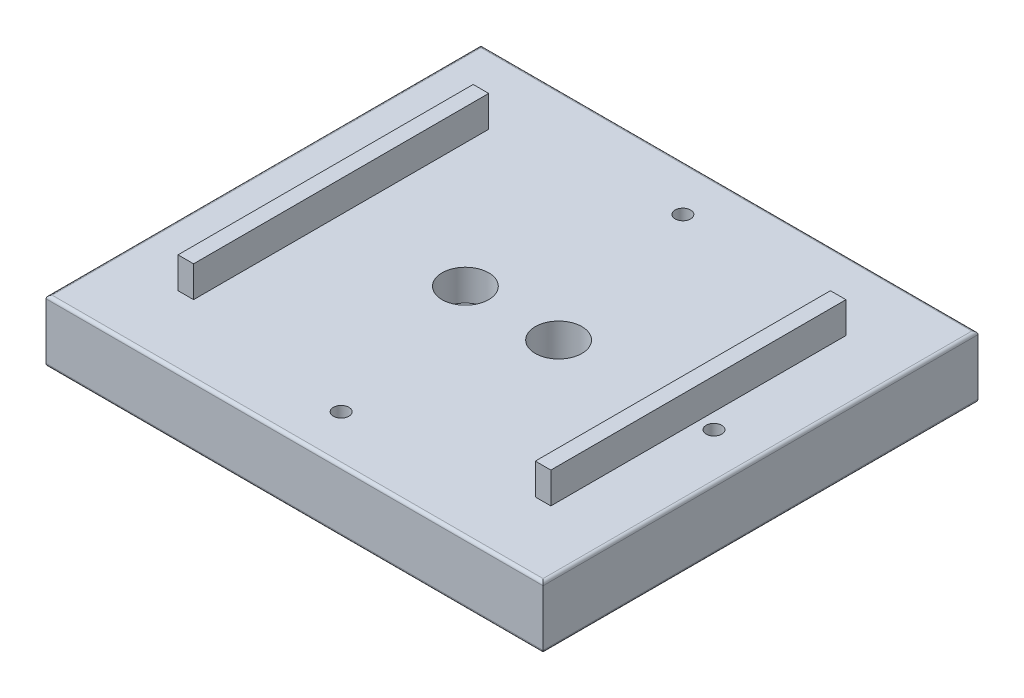
ISO-10303-21;
HEADER;
FILE_DESCRIPTION(('STEP AP214'),'2;1');
FILE_NAME('part.step','',(''),(''),'','','');
FILE_SCHEMA(('AUTOMOTIVE_DESIGN { 1 0 10303 214 1 1 1 1 }'));
ENDSEC;
DATA;
#1=APPLICATION_CONTEXT('core data for automotive mechanical design processes');
#2=APPLICATION_PROTOCOL_DEFINITION('international standard','automotive_design',2000,#1);
#3=PRODUCT_CONTEXT('',#1,'mechanical');
#4=PRODUCT('Part','Part','',(#3));
#5=PRODUCT_RELATED_PRODUCT_CATEGORY('part','',(#4));
#6=PRODUCT_DEFINITION_FORMATION('','',#4);
#7=PRODUCT_DEFINITION_CONTEXT('part definition',#1,'design');
#8=PRODUCT_DEFINITION('design','',#6,#7);
#9=PRODUCT_DEFINITION_SHAPE('','',#8);
#10=(LENGTH_UNIT() NAMED_UNIT(*) SI_UNIT(.MILLI.,.METRE.));
#11=(NAMED_UNIT(*) PLANE_ANGLE_UNIT() SI_UNIT($,.RADIAN.));
#12=(NAMED_UNIT(*) SI_UNIT($,.STERADIAN.) SOLID_ANGLE_UNIT());
#13=UNCERTAINTY_MEASURE_WITH_UNIT(LENGTH_MEASURE(1.E-05),#10,'distance_accuracy_value','');
#14=(GEOMETRIC_REPRESENTATION_CONTEXT(3) GLOBAL_UNCERTAINTY_ASSIGNED_CONTEXT((#13)) GLOBAL_UNIT_ASSIGNED_CONTEXT((#10,
#11,#12)) REPRESENTATION_CONTEXT('',''));
#15=CARTESIAN_POINT('',(0.,0.,0.));
#16=DIRECTION('',(0.,0.,1.));
#17=DIRECTION('',(1.,0.,0.));
#18=AXIS2_PLACEMENT_3D('',#15,#16,#17);
#19=CARTESIAN_POINT('',(0.,20.,0.));
#20=DIRECTION('',(0.,-1.,0.));
#21=DIRECTION('',(0.,0.,-1.));
#22=AXIS2_PLACEMENT_3D('',#19,#20,#21);
#23=PLANE('',#22);
#24=CARTESIAN_POINT('',(-15.,20.,0.));
#25=DIRECTION('',(0.,-1.,0.));
#26=DIRECTION('',(0.,0.,1.));
#27=AXIS2_PLACEMENT_3D('',#24,#25,#26);
#28=CIRCLE('',#27,7.5);
#29=CARTESIAN_POINT('',(-15.,20.,7.5));
#30=VERTEX_POINT('',#29);
#31=EDGE_CURVE('E754',#30,#30,#28,.T.);
#32=ORIENTED_EDGE('',*,*,#31,.T.);
#33=EDGE_LOOP('',(#32));
#34=FACE_BOUND('',#33,.T.);
#35=CARTESIAN_POINT('',(15.,20.,0.));
#36=DIRECTION('',(0.,-1.,0.));
#37=DIRECTION('',(0.,0.,-1.));
#38=AXIS2_PLACEMENT_3D('',#35,#36,#37);
#39=CIRCLE('',#38,7.5);
#40=CARTESIAN_POINT('',(15.,20.,-7.5));
#41=VERTEX_POINT('',#40);
#42=EDGE_CURVE('E277',#41,#41,#39,.T.);
#43=ORIENTED_EDGE('',*,*,#42,.T.);
#44=EDGE_LOOP('',(#43));
#45=FACE_BOUND('',#44,.T.);
#46=DIRECTION('',(-1.,0.,0.));
#47=VECTOR('',#46,1.);
#48=CARTESIAN_POINT('',(0.,20.,-69.));
#49=LINE('',#48,#47);
#50=CARTESIAN_POINT('',(79.,20.,-69.));
#51=VERTEX_POINT('',#50);
#52=CARTESIAN_POINT('',(-79.,20.,-69.));
#53=VERTEX_POINT('',#52);
#54=EDGE_CURVE('E233',#51,#53,#49,.T.);
#55=ORIENTED_EDGE('',*,*,#54,.T.);
#56=DIRECTION('',(0.,0.,1.));
#57=VECTOR('',#56,1.);
#58=CARTESIAN_POINT('',(-79.,20.,0.));
#59=LINE('',#58,#57);
#60=CARTESIAN_POINT('',(-79.,20.,69.));
#61=VERTEX_POINT('',#60);
#62=EDGE_CURVE('E237',#53,#61,#59,.T.);
#63=ORIENTED_EDGE('',*,*,#62,.T.);
#64=DIRECTION('',(1.,0.,0.));
#65=VECTOR('',#64,1.);
#66=CARTESIAN_POINT('',(0.,20.,69.));
#67=LINE('',#66,#65);
#68=CARTESIAN_POINT('',(79.,20.,69.));
#69=VERTEX_POINT('',#68);
#70=EDGE_CURVE('E235',#61,#69,#67,.T.);
#71=ORIENTED_EDGE('',*,*,#70,.T.);
#72=DIRECTION('',(0.,0.,-1.));
#73=VECTOR('',#72,1.);
#74=CARTESIAN_POINT('',(79.,20.,0.));
#75=LINE('',#74,#73);
#76=EDGE_CURVE('E231',#69,#51,#75,.T.);
#77=ORIENTED_EDGE('',*,*,#76,.T.);
#78=EDGE_LOOP('',(#55,#63,#71,#77));
#79=FACE_BOUND('',#78,.T.);
#80=CARTESIAN_POINT('',(65.,20.,0.));
#81=DIRECTION('',(0.,-1.,0.));
#82=DIRECTION('',(0.,0.,-1.));
#83=AXIS2_PLACEMENT_3D('',#80,#81,#82);
#84=CIRCLE('',#83,2.5);
#85=CARTESIAN_POINT('',(65.,20.,-2.5));
#86=VERTEX_POINT('',#85);
#87=EDGE_CURVE('E771',#86,#86,#84,.T.);
#88=ORIENTED_EDGE('',*,*,#87,.T.);
#89=EDGE_LOOP('',(#88));
#90=FACE_BOUND('',#89,.T.);
#91=CARTESIAN_POINT('',(0.,20.,-55.));
#92=DIRECTION('',(0.,-1.,0.));
#93=DIRECTION('',(0.,0.,-1.));
#94=AXIS2_PLACEMENT_3D('',#91,#92,#93);
#95=CIRCLE('',#94,2.5);
#96=CARTESIAN_POINT('',(0.,20.,-57.5));
#97=VERTEX_POINT('',#96);
#98=EDGE_CURVE('E780',#97,#97,#95,.T.);
#99=ORIENTED_EDGE('',*,*,#98,.T.);
#100=EDGE_LOOP('',(#99));
#101=FACE_BOUND('',#100,.T.);
#102=CARTESIAN_POINT('',(0.,20.,55.));
#103=DIRECTION('',(0.,-1.,0.));
#104=DIRECTION('',(0.,0.,-1.));
#105=AXIS2_PLACEMENT_3D('',#102,#103,#104);
#106=CIRCLE('',#105,2.5);
#107=CARTESIAN_POINT('',(0.,20.,52.5));
#108=VERTEX_POINT('',#107);
#109=EDGE_CURVE('E789',#108,#108,#106,.T.);
#110=ORIENTED_EDGE('',*,*,#109,.T.);
#111=EDGE_LOOP('',(#110));
#112=FACE_BOUND('',#111,.T.);
#113=CARTESIAN_POINT('',(-65.,20.,0.));
#114=DIRECTION('',(0.,-1.,0.));
#115=DIRECTION('',(0.,0.,-1.));
#116=AXIS2_PLACEMENT_3D('',#113,#114,#115);
#117=CIRCLE('',#116,2.5);
#118=CARTESIAN_POINT('',(-65.,20.,-2.5));
#119=VERTEX_POINT('',#118);
#120=EDGE_CURVE('E798',#119,#119,#117,.T.);
#121=ORIENTED_EDGE('',*,*,#120,.T.);
#122=EDGE_LOOP('',(#121));
#123=FACE_BOUND('',#122,.T.);
#124=DIRECTION('',(0.,0.,1.));
#125=VECTOR('',#124,1.);
#126=CARTESIAN_POINT('',(-60.,20.,-47.5));
#127=LINE('',#126,#125);
#128=CARTESIAN_POINT('',(-60.,20.,-47.5));
#129=VERTEX_POINT('',#128);
#130=CARTESIAN_POINT('',(-60.,20.,47.5));
#131=VERTEX_POINT('',#130);
#132=EDGE_CURVE('E181',#129,#131,#127,.T.);
#133=ORIENTED_EDGE('',*,*,#132,.F.);
#134=DIRECTION('',(-1.,0.,0.));
#135=VECTOR('',#134,1.);
#136=CARTESIAN_POINT('',(-60.,20.,-47.5));
#137=LINE('',#136,#135);
#138=CARTESIAN_POINT('',(-55.,20.,-47.5));
#139=VERTEX_POINT('',#138);
#140=EDGE_CURVE('E194',#139,#129,#137,.T.);
#141=ORIENTED_EDGE('',*,*,#140,.F.);
#142=DIRECTION('',(0.,0.,-1.));
#143=VECTOR('',#142,1.);
#144=CARTESIAN_POINT('',(-55.,20.,-47.5));
#145=LINE('',#144,#143);
#146=CARTESIAN_POINT('',(-55.,20.,47.5));
#147=VERTEX_POINT('',#146);
#148=EDGE_CURVE('E203',#147,#139,#145,.T.);
#149=ORIENTED_EDGE('',*,*,#148,.F.);
#150=DIRECTION('',(1.,0.,0.));
#151=VECTOR('',#150,1.);
#152=CARTESIAN_POINT('',(-60.,20.,47.5));
#153=LINE('',#152,#151);
#154=EDGE_CURVE('E184',#131,#147,#153,.T.);
#155=ORIENTED_EDGE('',*,*,#154,.F.);
#156=EDGE_LOOP('',(#133,#141,#149,#155));
#157=FACE_BOUND('',#156,.T.);
#158=DIRECTION('',(0.,0.,-1.));
#159=VECTOR('',#158,1.);
#160=CARTESIAN_POINT('',(60.,20.,-47.5));
#161=LINE('',#160,#159);
#162=CARTESIAN_POINT('',(60.,20.,47.4999999999999));
#163=VERTEX_POINT('',#162);
#164=CARTESIAN_POINT('',(60.,20.,-47.5));
#165=VERTEX_POINT('',#164);
#166=EDGE_CURVE('E180',#163,#165,#161,.T.);
#167=ORIENTED_EDGE('',*,*,#166,.F.);
#168=DIRECTION('',(1.,0.,0.));
#169=VECTOR('',#168,1.);
#170=CARTESIAN_POINT('',(60.,20.,47.4999999999999));
#171=LINE('',#170,#169);
#172=CARTESIAN_POINT('',(55.,20.,47.5));
#173=VERTEX_POINT('',#172);
#174=EDGE_CURVE('E177',#173,#163,#171,.T.);
#175=ORIENTED_EDGE('',*,*,#174,.F.);
#176=DIRECTION('',(0.,0.,1.));
#177=VECTOR('',#176,1.);
#178=CARTESIAN_POINT('',(55.,20.,-47.5));
#179=LINE('',#178,#177);
#180=CARTESIAN_POINT('',(55.,20.,-47.5));
#181=VERTEX_POINT('',#180);
#182=EDGE_CURVE('E807',#181,#173,#179,.T.);
#183=ORIENTED_EDGE('',*,*,#182,.F.);
#184=DIRECTION('',(-1.,0.,0.));
#185=VECTOR('',#184,1.);
#186=CARTESIAN_POINT('',(60.,20.,-47.5));
#187=LINE('',#186,#185);
#188=EDGE_CURVE('E805',#165,#181,#187,.T.);
#189=ORIENTED_EDGE('',*,*,#188,.F.);
#190=EDGE_LOOP('',(#167,#175,#183,#189));
#191=FACE_BOUND('',#190,.T.);
#192=ADVANCED_FACE('F41',(#34,#45,#79,#90,#101,#112,#123,#157,#191),#23,.F.);
#193=CARTESIAN_POINT('',(-80.,20.,70.));
#194=DIRECTION('',(1.,0.,0.));
#195=DIRECTION('',(0.,0.,-1.));
#196=AXIS2_PLACEMENT_3D('',#193,#194,#195);
#197=PLANE('',#196);
#198=DIRECTION('',(0.,-1.,0.));
#199=VECTOR('',#198,1.);
#200=CARTESIAN_POINT('',(-80.,20.,70.));
#201=LINE('',#200,#199);
#202=CARTESIAN_POINT('',(-80.,19.,70.));
#203=VERTEX_POINT('',#202);
#204=CARTESIAN_POINT('',(-80.,1.,70.));
#205=VERTEX_POINT('',#204);
#206=EDGE_CURVE('E228',#203,#205,#201,.T.);
#207=ORIENTED_EDGE('',*,*,#206,.F.);
#208=DIRECTION('',(0.,0.,1.));
#209=VECTOR('',#208,1.);
#210=CARTESIAN_POINT('',(-80.,19.,70.));
#211=LINE('',#210,#209);
#212=CARTESIAN_POINT('',(-80.,19.,-70.));
#213=VERTEX_POINT('',#212);
#214=EDGE_CURVE('E242',#203,#213,#211,.F.);
#215=ORIENTED_EDGE('',*,*,#214,.T.);
#216=DIRECTION('',(0.,-1.,0.));
#217=VECTOR('',#216,1.);
#218=CARTESIAN_POINT('',(-80.,20.,-70.));
#219=LINE('',#218,#217);
#220=CARTESIAN_POINT('',(-80.,1.,-70.));
#221=VERTEX_POINT('',#220);
#222=EDGE_CURVE('E219',#213,#221,#219,.T.);
#223=ORIENTED_EDGE('',*,*,#222,.T.);
#224=DIRECTION('',(0.,0.,1.));
#225=VECTOR('',#224,1.);
#226=CARTESIAN_POINT('',(-80.,1.,70.));
#227=LINE('',#226,#225);
#228=EDGE_CURVE('E240',#221,#205,#227,.T.);
#229=ORIENTED_EDGE('',*,*,#228,.T.);
#230=EDGE_LOOP('',(#207,#215,#223,#229));
#231=FACE_BOUND('',#230,.T.);
#232=ADVANCED_FACE('F315',(#231),#197,.F.);
#233=CARTESIAN_POINT('',(-80.,20.,70.));
#234=DIRECTION('',(0.,0.,-1.));
#235=DIRECTION('',(-1.,0.,0.));
#236=AXIS2_PLACEMENT_3D('',#233,#234,#235);
#237=PLANE('',#236);
#238=DIRECTION('',(0.,-1.,0.));
#239=VECTOR('',#238,1.);
#240=CARTESIAN_POINT('',(80.,20.,70.));
#241=LINE('',#240,#239);
#242=CARTESIAN_POINT('',(80.,19.,70.));
#243=VERTEX_POINT('',#242);
#244=CARTESIAN_POINT('',(80.,1.,70.));
#245=VERTEX_POINT('',#244);
#246=EDGE_CURVE('E225',#243,#245,#241,.T.);
#247=ORIENTED_EDGE('',*,*,#246,.F.);
#248=DIRECTION('',(1.,0.,0.));
#249=VECTOR('',#248,1.);
#250=CARTESIAN_POINT('',(-80.,19.,70.));
#251=LINE('',#250,#249);
#252=EDGE_CURVE('E247',#243,#203,#251,.F.);
#253=ORIENTED_EDGE('',*,*,#252,.T.);
#254=ORIENTED_EDGE('',*,*,#206,.T.);
#255=DIRECTION('',(1.,0.,0.));
#256=VECTOR('',#255,1.);
#257=CARTESIAN_POINT('',(80.,1.,70.));
#258=LINE('',#257,#256);
#259=EDGE_CURVE('E245',#205,#245,#258,.T.);
#260=ORIENTED_EDGE('',*,*,#259,.T.);
#261=EDGE_LOOP('',(#247,#253,#254,#260));
#262=FACE_BOUND('',#261,.T.);
#263=ADVANCED_FACE('F330',(#262),#237,.F.);
#264=CARTESIAN_POINT('',(80.,20.,70.));
#265=DIRECTION('',(-1.,0.,0.));
#266=DIRECTION('',(0.,0.,1.));
#267=AXIS2_PLACEMENT_3D('',#264,#265,#266);
#268=PLANE('',#267);
#269=DIRECTION('',(0.,-1.,0.));
#270=VECTOR('',#269,1.);
#271=CARTESIAN_POINT('',(80.,20.,-70.));
#272=LINE('',#271,#270);
#273=CARTESIAN_POINT('',(80.,19.,-70.));
#274=VERTEX_POINT('',#273);
#275=CARTESIAN_POINT('',(80.,1.,-70.));
#276=VERTEX_POINT('',#275);
#277=EDGE_CURVE('E222',#274,#276,#272,.T.);
#278=ORIENTED_EDGE('',*,*,#277,.F.);
#279=DIRECTION('',(0.,0.,-1.));
#280=VECTOR('',#279,1.);
#281=CARTESIAN_POINT('',(80.,19.,70.));
#282=LINE('',#281,#280);
#283=EDGE_CURVE('E256',#274,#243,#282,.F.);
#284=ORIENTED_EDGE('',*,*,#283,.T.);
#285=ORIENTED_EDGE('',*,*,#246,.T.);
#286=DIRECTION('',(0.,0.,-1.));
#287=VECTOR('',#286,1.);
#288=CARTESIAN_POINT('',(80.,1.,-70.));
#289=LINE('',#288,#287);
#290=EDGE_CURVE('E253',#245,#276,#289,.T.);
#291=ORIENTED_EDGE('',*,*,#290,.T.);
#292=EDGE_LOOP('',(#278,#284,#285,#291));
#293=FACE_BOUND('',#292,.T.);
#294=ADVANCED_FACE('F301',(#293),#268,.F.);
#295=CARTESIAN_POINT('',(-80.,20.,-70.));
#296=DIRECTION('',(0.,0.,1.));
#297=DIRECTION('',(1.,0.,0.));
#298=AXIS2_PLACEMENT_3D('',#295,#296,#297);
#299=PLANE('',#298);
#300=ORIENTED_EDGE('',*,*,#222,.F.);
#301=DIRECTION('',(-1.,0.,0.));
#302=VECTOR('',#301,1.);
#303=CARTESIAN_POINT('',(-80.,19.,-70.));
#304=LINE('',#303,#302);
#305=EDGE_CURVE('E251',#213,#274,#304,.F.);
#306=ORIENTED_EDGE('',*,*,#305,.T.);
#307=ORIENTED_EDGE('',*,*,#277,.T.);
#308=DIRECTION('',(-1.,0.,0.));
#309=VECTOR('',#308,1.);
#310=CARTESIAN_POINT('',(-80.,1.,-70.));
#311=LINE('',#310,#309);
#312=EDGE_CURVE('E249',#276,#221,#311,.T.);
#313=ORIENTED_EDGE('',*,*,#312,.T.);
#314=EDGE_LOOP('',(#300,#306,#307,#313));
#315=FACE_BOUND('',#314,.T.);
#316=ADVANCED_FACE('F304',(#315),#299,.F.);
#317=CARTESIAN_POINT('',(0.,0.,0.));
#318=DIRECTION('',(0.,-1.,0.));
#319=DIRECTION('',(0.,0.,-1.));
#320=AXIS2_PLACEMENT_3D('',#317,#318,#319);
#321=PLANE('',#320);
#322=DIRECTION('',(-1.,0.,0.));
#323=VECTOR('',#322,1.);
#324=CARTESIAN_POINT('',(80.,0.,-69.));
#325=LINE('',#324,#323);
#326=CARTESIAN_POINT('',(-79.,0.,-69.));
#327=VERTEX_POINT('',#326);
#328=CARTESIAN_POINT('',(79.,0.,-69.));
#329=VERTEX_POINT('',#328);
#330=EDGE_CURVE('E258',#327,#329,#325,.F.);
#331=ORIENTED_EDGE('',*,*,#330,.T.);
#332=DIRECTION('',(0.,0.,-1.));
#333=VECTOR('',#332,1.);
#334=CARTESIAN_POINT('',(79.,0.,70.));
#335=LINE('',#334,#333);
#336=CARTESIAN_POINT('',(79.,0.,69.));
#337=VERTEX_POINT('',#336);
#338=EDGE_CURVE('E11',#329,#337,#335,.F.);
#339=ORIENTED_EDGE('',*,*,#338,.T.);
#340=DIRECTION('',(1.,0.,0.));
#341=VECTOR('',#340,1.);
#342=CARTESIAN_POINT('',(-80.,0.,69.));
#343=LINE('',#342,#341);
#344=CARTESIAN_POINT('',(-79.,0.,69.));
#345=VERTEX_POINT('',#344);
#346=EDGE_CURVE('E50',#337,#345,#343,.F.);
#347=ORIENTED_EDGE('',*,*,#346,.T.);
#348=DIRECTION('',(0.,0.,1.));
#349=VECTOR('',#348,1.);
#350=CARTESIAN_POINT('',(-79.,0.,-70.));
#351=LINE('',#350,#349);
#352=EDGE_CURVE('E260',#345,#327,#351,.F.);
#353=ORIENTED_EDGE('',*,*,#352,.T.);
#354=EDGE_LOOP('',(#331,#339,#347,#353));
#355=FACE_BOUND('',#354,.T.);
#356=CARTESIAN_POINT('',(15.,0.,0.));
#357=DIRECTION('',(0.,-1.,0.));
#358=DIRECTION('',(0.,0.,-1.));
#359=AXIS2_PLACEMENT_3D('',#356,#357,#358);
#360=CIRCLE('',#359,16.);
#361=CARTESIAN_POINT('',(15.,0.,-16.));
#362=VERTEX_POINT('',#361);
#363=EDGE_CURVE('E274',#362,#362,#360,.T.);
#364=ORIENTED_EDGE('',*,*,#363,.F.);
#365=EDGE_LOOP('',(#364));
#366=FACE_BOUND('',#365,.T.);
#367=CARTESIAN_POINT('',(65.,0.,0.));
#368=DIRECTION('',(0.,-1.,0.));
#369=DIRECTION('',(0.,0.,-1.));
#370=AXIS2_PLACEMENT_3D('',#367,#368,#369);
#371=CIRCLE('',#370,3.025);
#372=CARTESIAN_POINT('',(65.,0.,-3.025));
#373=VERTEX_POINT('',#372);
#374=EDGE_CURVE('E763',#373,#373,#371,.T.);
#375=ORIENTED_EDGE('',*,*,#374,.F.);
#376=EDGE_LOOP('',(#375));
#377=FACE_BOUND('',#376,.T.);
#378=CARTESIAN_POINT('',(0.,0.,-55.));
#379=DIRECTION('',(0.,-1.,0.));
#380=DIRECTION('',(0.,0.,-1.));
#381=AXIS2_PLACEMENT_3D('',#378,#379,#380);
#382=CIRCLE('',#381,3.025);
#383=CARTESIAN_POINT('',(0.,0.,-58.025));
#384=VERTEX_POINT('',#383);
#385=EDGE_CURVE('E774',#384,#384,#382,.T.);
#386=ORIENTED_EDGE('',*,*,#385,.F.);
#387=EDGE_LOOP('',(#386));
#388=FACE_BOUND('',#387,.T.);
#389=CARTESIAN_POINT('',(0.,0.,55.));
#390=DIRECTION('',(0.,-1.,0.));
#391=DIRECTION('',(0.,0.,-1.));
#392=AXIS2_PLACEMENT_3D('',#389,#390,#391);
#393=CIRCLE('',#392,3.025);
#394=CARTESIAN_POINT('',(0.,0.,51.975));
#395=VERTEX_POINT('',#394);
#396=EDGE_CURVE('E783',#395,#395,#393,.T.);
#397=ORIENTED_EDGE('',*,*,#396,.F.);
#398=EDGE_LOOP('',(#397));
#399=FACE_BOUND('',#398,.T.);
#400=CARTESIAN_POINT('',(-65.,0.,0.));
#401=DIRECTION('',(0.,-1.,0.));
#402=DIRECTION('',(0.,0.,-1.));
#403=AXIS2_PLACEMENT_3D('',#400,#401,#402);
#404=CIRCLE('',#403,3.025);
#405=CARTESIAN_POINT('',(-65.,0.,-3.025));
#406=VERTEX_POINT('',#405);
#407=EDGE_CURVE('E792',#406,#406,#404,.T.);
#408=ORIENTED_EDGE('',*,*,#407,.F.);
#409=EDGE_LOOP('',(#408));
#410=FACE_BOUND('',#409,.T.);
#411=ADVANCED_FACE('F290',(#355,#366,#377,#388,#399,#410),#321,.T.);
#412=CARTESIAN_POINT('',(-60.,30.,-47.5));
#413=DIRECTION('',(1.,0.,0.));
#414=DIRECTION('',(0.,0.,-1.));
#415=AXIS2_PLACEMENT_3D('',#412,#413,#414);
#416=PLANE('',#415);
#417=ORIENTED_EDGE('',*,*,#132,.T.);
#418=DIRECTION('',(0.,-1.,0.));
#419=VECTOR('',#418,1.);
#420=CARTESIAN_POINT('',(-60.,30.,47.5));
#421=LINE('',#420,#419);
#422=CARTESIAN_POINT('',(-60.,30.,47.5));
#423=VERTEX_POINT('',#422);
#424=EDGE_CURVE('E216',#423,#131,#421,.T.);
#425=ORIENTED_EDGE('',*,*,#424,.F.);
#426=DIRECTION('',(0.,0.,1.));
#427=VECTOR('',#426,1.);
#428=CARTESIAN_POINT('',(-60.,30.,-47.5));
#429=LINE('',#428,#427);
#430=CARTESIAN_POINT('',(-60.,30.,-47.5));
#431=VERTEX_POINT('',#430);
#432=EDGE_CURVE('E190',#431,#423,#429,.T.);
#433=ORIENTED_EDGE('',*,*,#432,.F.);
#434=DIRECTION('',(0.,-1.,0.));
#435=VECTOR('',#434,1.);
#436=CARTESIAN_POINT('',(-60.,30.,-47.5));
#437=LINE('',#436,#435);
#438=EDGE_CURVE('E199',#431,#129,#437,.T.);
#439=ORIENTED_EDGE('',*,*,#438,.T.);
#440=EDGE_LOOP('',(#417,#425,#433,#439));
#441=FACE_BOUND('',#440,.T.);
#442=ADVANCED_FACE('F348',(#441),#416,.F.);
#443=CARTESIAN_POINT('',(-60.,30.,47.5));
#444=DIRECTION('',(0.,0.,-1.));
#445=DIRECTION('',(-1.,0.,0.));
#446=AXIS2_PLACEMENT_3D('',#443,#444,#445);
#447=PLANE('',#446);
#448=ORIENTED_EDGE('',*,*,#154,.T.);
#449=DIRECTION('',(0.,-1.,0.));
#450=VECTOR('',#449,1.);
#451=CARTESIAN_POINT('',(-55.,30.,47.5));
#452=LINE('',#451,#450);
#453=CARTESIAN_POINT('',(-55.,30.,47.5));
#454=VERTEX_POINT('',#453);
#455=EDGE_CURVE('E213',#454,#147,#452,.T.);
#456=ORIENTED_EDGE('',*,*,#455,.F.);
#457=DIRECTION('',(1.,0.,0.));
#458=VECTOR('',#457,1.);
#459=CARTESIAN_POINT('',(-60.,30.,47.5));
#460=LINE('',#459,#458);
#461=EDGE_CURVE('E193',#423,#454,#460,.T.);
#462=ORIENTED_EDGE('',*,*,#461,.F.);
#463=ORIENTED_EDGE('',*,*,#424,.T.);
#464=EDGE_LOOP('',(#448,#456,#462,#463));
#465=FACE_BOUND('',#464,.T.);
#466=ADVANCED_FACE('F368',(#465),#447,.F.);
#467=CARTESIAN_POINT('',(-55.,30.,-47.5));
#468=DIRECTION('',(-1.,0.,0.));
#469=DIRECTION('',(0.,0.,1.));
#470=AXIS2_PLACEMENT_3D('',#467,#468,#469);
#471=PLANE('',#470);
#472=ORIENTED_EDGE('',*,*,#148,.T.);
#473=DIRECTION('',(0.,-1.,0.));
#474=VECTOR('',#473,1.);
#475=CARTESIAN_POINT('',(-55.,30.,-47.5));
#476=LINE('',#475,#474);
#477=CARTESIAN_POINT('',(-55.,30.,-47.5));
#478=VERTEX_POINT('',#477);
#479=EDGE_CURVE('E210',#478,#139,#476,.T.);
#480=ORIENTED_EDGE('',*,*,#479,.F.);
#481=DIRECTION('',(0.,0.,-1.));
#482=VECTOR('',#481,1.);
#483=CARTESIAN_POINT('',(-55.,30.,-47.5));
#484=LINE('',#483,#482);
#485=EDGE_CURVE('E196',#454,#478,#484,.T.);
#486=ORIENTED_EDGE('',*,*,#485,.F.);
#487=ORIENTED_EDGE('',*,*,#455,.T.);
#488=EDGE_LOOP('',(#472,#480,#486,#487));
#489=FACE_BOUND('',#488,.T.);
#490=ADVANCED_FACE('F375',(#489),#471,.F.);
#491=CARTESIAN_POINT('',(-60.,30.,-47.5));
#492=DIRECTION('',(0.,0.,1.));
#493=DIRECTION('',(1.,0.,0.));
#494=AXIS2_PLACEMENT_3D('',#491,#492,#493);
#495=PLANE('',#494);
#496=ORIENTED_EDGE('',*,*,#140,.T.);
#497=ORIENTED_EDGE('',*,*,#438,.F.);
#498=DIRECTION('',(-1.,0.,0.));
#499=VECTOR('',#498,1.);
#500=CARTESIAN_POINT('',(-60.,30.,-47.5));
#501=LINE('',#500,#499);
#502=EDGE_CURVE('E198',#478,#431,#501,.T.);
#503=ORIENTED_EDGE('',*,*,#502,.F.);
#504=ORIENTED_EDGE('',*,*,#479,.T.);
#505=EDGE_LOOP('',(#496,#497,#503,#504));
#506=FACE_BOUND('',#505,.T.);
#507=ADVANCED_FACE('F382',(#506),#495,.F.);
#508=CARTESIAN_POINT('',(0.,30.,0.));
#509=DIRECTION('',(0.,1.,0.));
#510=DIRECTION('',(0.,0.,1.));
#511=AXIS2_PLACEMENT_3D('',#508,#509,#510);
#512=PLANE('',#511);
#513=ORIENTED_EDGE('',*,*,#432,.T.);
#514=ORIENTED_EDGE('',*,*,#461,.T.);
#515=ORIENTED_EDGE('',*,*,#485,.T.);
#516=ORIENTED_EDGE('',*,*,#502,.T.);
#517=EDGE_LOOP('',(#513,#514,#515,#516));
#518=FACE_BOUND('',#517,.T.);
#519=ADVANCED_FACE('F390',(#518),#512,.T.);
#520=CARTESIAN_POINT('',(60.,30.,-47.5));
#521=DIRECTION('',(-1.,0.,0.));
#522=DIRECTION('',(0.,0.,1.));
#523=AXIS2_PLACEMENT_3D('',#520,#521,#522);
#524=PLANE('',#523);
#525=ORIENTED_EDGE('',*,*,#166,.T.);
#526=DIRECTION('',(0.,-1.,0.));
#527=VECTOR('',#526,1.);
#528=CARTESIAN_POINT('',(60.,30.,-47.5));
#529=LINE('',#528,#527);
#530=CARTESIAN_POINT('',(60.,30.,-47.5));
#531=VERTEX_POINT('',#530);
#532=EDGE_CURVE('E161',#531,#165,#529,.T.);
#533=ORIENTED_EDGE('',*,*,#532,.F.);
#534=DIRECTION('',(0.,0.,-1.));
#535=VECTOR('',#534,1.);
#536=CARTESIAN_POINT('',(60.,30.,-47.5));
#537=LINE('',#536,#535);
#538=CARTESIAN_POINT('',(60.,30.,47.4999999999999));
#539=VERTEX_POINT('',#538);
#540=EDGE_CURVE('E168',#539,#531,#537,.T.);
#541=ORIENTED_EDGE('',*,*,#540,.F.);
#542=DIRECTION('',(0.,-1.,0.));
#543=VECTOR('',#542,1.);
#544=CARTESIAN_POINT('',(60.,30.,47.4999999999999));
#545=LINE('',#544,#543);
#546=EDGE_CURVE('E803',#539,#163,#545,.T.);
#547=ORIENTED_EDGE('',*,*,#546,.T.);
#548=EDGE_LOOP('',(#525,#533,#541,#547));
#549=FACE_BOUND('',#548,.T.);
#550=ADVANCED_FACE('F179',(#549),#524,.F.);
#551=CARTESIAN_POINT('',(60.,30.,-47.5));
#552=DIRECTION('',(0.,0.,1.));
#553=DIRECTION('',(1.,0.,0.));
#554=AXIS2_PLACEMENT_3D('',#551,#552,#553);
#555=PLANE('',#554);
#556=ORIENTED_EDGE('',*,*,#188,.T.);
#557=DIRECTION('',(0.,-1.,0.));
#558=VECTOR('',#557,1.);
#559=CARTESIAN_POINT('',(55.,30.,-47.5));
#560=LINE('',#559,#558);
#561=CARTESIAN_POINT('',(55.,30.,-47.5));
#562=VERTEX_POINT('',#561);
#563=EDGE_CURVE('E164',#562,#181,#560,.T.);
#564=ORIENTED_EDGE('',*,*,#563,.F.);
#565=DIRECTION('',(-1.,0.,0.));
#566=VECTOR('',#565,1.);
#567=CARTESIAN_POINT('',(60.,30.,-47.5));
#568=LINE('',#567,#566);
#569=EDGE_CURVE('E156',#531,#562,#568,.T.);
#570=ORIENTED_EDGE('',*,*,#569,.F.);
#571=ORIENTED_EDGE('',*,*,#532,.T.);
#572=EDGE_LOOP('',(#556,#564,#570,#571));
#573=FACE_BOUND('',#572,.T.);
#574=ADVANCED_FACE('F159',(#573),#555,.F.);
#575=CARTESIAN_POINT('',(55.,30.,-47.5));
#576=DIRECTION('',(1.,0.,0.));
#577=DIRECTION('',(0.,0.,-1.));
#578=AXIS2_PLACEMENT_3D('',#575,#576,#577);
#579=PLANE('',#578);
#580=ORIENTED_EDGE('',*,*,#182,.T.);
#581=DIRECTION('',(0.,-1.,0.));
#582=VECTOR('',#581,1.);
#583=CARTESIAN_POINT('',(55.,30.,47.5));
#584=LINE('',#583,#582);
#585=CARTESIAN_POINT('',(55.,30.,47.5));
#586=VERTEX_POINT('',#585);
#587=EDGE_CURVE('E186',#586,#173,#584,.T.);
#588=ORIENTED_EDGE('',*,*,#587,.F.);
#589=DIRECTION('',(0.,0.,1.));
#590=VECTOR('',#589,1.);
#591=CARTESIAN_POINT('',(55.,30.,-47.5));
#592=LINE('',#591,#590);
#593=EDGE_CURVE('E167',#562,#586,#592,.T.);
#594=ORIENTED_EDGE('',*,*,#593,.F.);
#595=ORIENTED_EDGE('',*,*,#563,.T.);
#596=EDGE_LOOP('',(#580,#588,#594,#595));
#597=FACE_BOUND('',#596,.T.);
#598=ADVANCED_FACE('F411',(#597),#579,.F.);
#599=CARTESIAN_POINT('',(60.,30.,47.4999999999999));
#600=DIRECTION('',(0.,0.,-1.));
#601=DIRECTION('',(-1.,0.,0.));
#602=AXIS2_PLACEMENT_3D('',#599,#600,#601);
#603=PLANE('',#602);
#604=ORIENTED_EDGE('',*,*,#174,.T.);
#605=ORIENTED_EDGE('',*,*,#546,.F.);
#606=DIRECTION('',(1.,0.,0.));
#607=VECTOR('',#606,1.);
#608=CARTESIAN_POINT('',(60.,30.,47.4999999999999));
#609=LINE('',#608,#607);
#610=EDGE_CURVE('E173',#586,#539,#609,.T.);
#611=ORIENTED_EDGE('',*,*,#610,.F.);
#612=ORIENTED_EDGE('',*,*,#587,.T.);
#613=EDGE_LOOP('',(#604,#605,#611,#612));
#614=FACE_BOUND('',#613,.T.);
#615=ADVANCED_FACE('F418',(#614),#603,.F.);
#616=CARTESIAN_POINT('',(0.,30.,0.));
#617=DIRECTION('',(0.,-1.,0.));
#618=DIRECTION('',(0.,0.,-1.));
#619=AXIS2_PLACEMENT_3D('',#616,#617,#618);
#620=PLANE('',#619);
#621=ORIENTED_EDGE('',*,*,#540,.T.);
#622=ORIENTED_EDGE('',*,*,#569,.T.);
#623=ORIENTED_EDGE('',*,*,#593,.T.);
#624=ORIENTED_EDGE('',*,*,#610,.T.);
#625=EDGE_LOOP('',(#621,#622,#623,#624));
#626=FACE_BOUND('',#625,.T.);
#627=ADVANCED_FACE('F171',(#626),#620,.F.);
#628=CARTESIAN_POINT('',(-65.,0.,0.));
#629=DIRECTION('',(0.,-1.,0.));
#630=DIRECTION('',(0.,0.,-1.));
#631=AXIS2_PLACEMENT_3D('',#628,#629,#630);
#632=CYLINDRICAL_SURFACE('',#631,2.5);
#633=ORIENTED_EDGE('',*,*,#120,.F.);
#634=EDGE_LOOP('',(#633));
#635=FACE_BOUND('',#634,.T.);
#636=CARTESIAN_POINT('',(-65.,0.525000000000001,0.));
#637=DIRECTION('',(0.,-1.,0.));
#638=DIRECTION('',(0.,0.,-1.));
#639=AXIS2_PLACEMENT_3D('',#636,#637,#638);
#640=CIRCLE('',#639,2.5);
#641=CARTESIAN_POINT('',(-65.,0.525000000000001,-2.5));
#642=VERTEX_POINT('',#641);
#643=EDGE_CURVE('E795',#642,#642,#640,.T.);
#644=ORIENTED_EDGE('',*,*,#643,.T.);
#645=EDGE_LOOP('',(#644));
#646=FACE_BOUND('',#645,.T.);
#647=ADVANCED_FACE('F433',(#635,#646),#632,.F.);
#648=CARTESIAN_POINT('',(-65.,0.,0.));
#649=DIRECTION('',(0.,-1.,0.));
#650=DIRECTION('',(0.,0.,-1.));
#651=AXIS2_PLACEMENT_3D('',#648,#649,#650);
#652=CONICAL_SURFACE('',#651,3.025,0.785398163397444);
#653=ORIENTED_EDGE('',*,*,#643,.F.);
#654=EDGE_LOOP('',(#653));
#655=FACE_BOUND('',#654,.T.);
#656=ORIENTED_EDGE('',*,*,#407,.T.);
#657=EDGE_LOOP('',(#656));
#658=FACE_BOUND('',#657,.T.);
#659=ADVANCED_FACE('F441',(#655,#658),#652,.F.);
#660=CARTESIAN_POINT('',(0.,0.,55.));
#661=DIRECTION('',(0.,-1.,0.));
#662=DIRECTION('',(0.,0.,-1.));
#663=AXIS2_PLACEMENT_3D('',#660,#661,#662);
#664=CYLINDRICAL_SURFACE('',#663,2.5);
#665=ORIENTED_EDGE('',*,*,#109,.F.);
#666=EDGE_LOOP('',(#665));
#667=FACE_BOUND('',#666,.T.);
#668=CARTESIAN_POINT('',(0.,0.525000000000001,55.));
#669=DIRECTION('',(0.,-1.,0.));
#670=DIRECTION('',(0.,0.,-1.));
#671=AXIS2_PLACEMENT_3D('',#668,#669,#670);
#672=CIRCLE('',#671,2.5);
#673=CARTESIAN_POINT('',(0.,0.525000000000001,52.5));
#674=VERTEX_POINT('',#673);
#675=EDGE_CURVE('E786',#674,#674,#672,.T.);
#676=ORIENTED_EDGE('',*,*,#675,.T.);
#677=EDGE_LOOP('',(#676));
#678=FACE_BOUND('',#677,.T.);
#679=ADVANCED_FACE('F450',(#667,#678),#664,.F.);
#680=CARTESIAN_POINT('',(0.,0.,55.));
#681=DIRECTION('',(0.,-1.,0.));
#682=DIRECTION('',(0.,0.,-1.));
#683=AXIS2_PLACEMENT_3D('',#680,#681,#682);
#684=CONICAL_SURFACE('',#683,3.025,0.785398163397447);
#685=ORIENTED_EDGE('',*,*,#675,.F.);
#686=EDGE_LOOP('',(#685));
#687=FACE_BOUND('',#686,.T.);
#688=ORIENTED_EDGE('',*,*,#396,.T.);
#689=EDGE_LOOP('',(#688));
#690=FACE_BOUND('',#689,.T.);
#691=ADVANCED_FACE('F458',(#687,#690),#684,.F.);
#692=CARTESIAN_POINT('',(0.,0.,-55.));
#693=DIRECTION('',(0.,-1.,0.));
#694=DIRECTION('',(0.,0.,-1.));
#695=AXIS2_PLACEMENT_3D('',#692,#693,#694);
#696=CYLINDRICAL_SURFACE('',#695,2.5);
#697=ORIENTED_EDGE('',*,*,#98,.F.);
#698=EDGE_LOOP('',(#697));
#699=FACE_BOUND('',#698,.T.);
#700=CARTESIAN_POINT('',(0.,0.525000000000001,-55.));
#701=DIRECTION('',(0.,-1.,0.));
#702=DIRECTION('',(0.,0.,-1.));
#703=AXIS2_PLACEMENT_3D('',#700,#701,#702);
#704=CIRCLE('',#703,2.5);
#705=CARTESIAN_POINT('',(0.,0.525000000000001,-57.5));
#706=VERTEX_POINT('',#705);
#707=EDGE_CURVE('E777',#706,#706,#704,.T.);
#708=ORIENTED_EDGE('',*,*,#707,.T.);
#709=EDGE_LOOP('',(#708));
#710=FACE_BOUND('',#709,.T.);
#711=ADVANCED_FACE('F465',(#699,#710),#696,.F.);
#712=CARTESIAN_POINT('',(0.,0.,-55.));
#713=DIRECTION('',(0.,-1.,0.));
#714=DIRECTION('',(0.,0.,-1.));
#715=AXIS2_PLACEMENT_3D('',#712,#713,#714);
#716=CONICAL_SURFACE('',#715,3.025,0.785398163397447);
#717=ORIENTED_EDGE('',*,*,#707,.F.);
#718=EDGE_LOOP('',(#717));
#719=FACE_BOUND('',#718,.T.);
#720=ORIENTED_EDGE('',*,*,#385,.T.);
#721=EDGE_LOOP('',(#720));
#722=FACE_BOUND('',#721,.T.);
#723=ADVANCED_FACE('F473',(#719,#722),#716,.F.);
#724=CARTESIAN_POINT('',(65.,0.,0.));
#725=DIRECTION('',(0.,-1.,0.));
#726=DIRECTION('',(0.,0.,-1.));
#727=AXIS2_PLACEMENT_3D('',#724,#725,#726);
#728=CYLINDRICAL_SURFACE('',#727,2.5);
#729=ORIENTED_EDGE('',*,*,#87,.F.);
#730=EDGE_LOOP('',(#729));
#731=FACE_BOUND('',#730,.T.);
#732=CARTESIAN_POINT('',(65.,0.525000000000001,0.));
#733=DIRECTION('',(0.,-1.,0.));
#734=DIRECTION('',(0.,0.,-1.));
#735=AXIS2_PLACEMENT_3D('',#732,#733,#734);
#736=CIRCLE('',#735,2.5);
#737=CARTESIAN_POINT('',(65.,0.525000000000001,-2.5));
#738=VERTEX_POINT('',#737);
#739=EDGE_CURVE('E768',#738,#738,#736,.T.);
#740=ORIENTED_EDGE('',*,*,#739,.T.);
#741=EDGE_LOOP('',(#740));
#742=FACE_BOUND('',#741,.T.);
#743=ADVANCED_FACE('F481',(#731,#742),#728,.F.);
#744=CARTESIAN_POINT('',(65.,0.,0.));
#745=DIRECTION('',(0.,-1.,0.));
#746=DIRECTION('',(0.,0.,-1.));
#747=AXIS2_PLACEMENT_3D('',#744,#745,#746);
#748=CONICAL_SURFACE('',#747,3.025,0.785398163397444);
#749=ORIENTED_EDGE('',*,*,#739,.F.);
#750=EDGE_LOOP('',(#749));
#751=FACE_BOUND('',#750,.T.);
#752=ORIENTED_EDGE('',*,*,#374,.T.);
#753=EDGE_LOOP('',(#752));
#754=FACE_BOUND('',#753,.T.);
#755=ADVANCED_FACE('F489',(#751,#754),#748,.F.);
#756=CARTESIAN_POINT('',(15.,3.15,0.));
#757=DIRECTION('',(0.,-1.,0.));
#758=DIRECTION('',(0.,0.,-1.));
#759=AXIS2_PLACEMENT_3D('',#756,#757,#758);
#760=CYLINDRICAL_SURFACE('',#759,16.);
#761=CARTESIAN_POINT('',(15.,3.15,0.));
#762=DIRECTION('',(0.,-1.,0.));
#763=DIRECTION('',(0.,0.,-1.));
#764=AXIS2_PLACEMENT_3D('',#761,#762,#763);
#765=CIRCLE('',#764,16.);
#766=CARTESIAN_POINT('',(15.,3.15,-16.));
#767=VERTEX_POINT('',#766);
#768=EDGE_CURVE('E760',#767,#767,#765,.T.);
#769=ORIENTED_EDGE('',*,*,#768,.F.);
#770=EDGE_LOOP('',(#769));
#771=FACE_BOUND('',#770,.T.);
#772=ORIENTED_EDGE('',*,*,#363,.T.);
#773=EDGE_LOOP('',(#772));
#774=FACE_BOUND('',#773,.T.);
#775=ADVANCED_FACE('F496',(#771,#774),#760,.F.);
#776=CARTESIAN_POINT('',(15.,3.15,0.));
#777=DIRECTION('',(0.,-1.,0.));
#778=DIRECTION('',(0.,0.,-1.));
#779=AXIS2_PLACEMENT_3D('',#776,#777,#778);
#780=PLANE('',#779);
#781=CARTESIAN_POINT('',(15.,3.15,0.));
#782=DIRECTION('',(0.,-1.,0.));
#783=DIRECTION('',(0.,0.,-1.));
#784=AXIS2_PLACEMENT_3D('',#781,#782,#783);
#785=CIRCLE('',#784,7.5);
#786=CARTESIAN_POINT('',(15.,3.15,-7.5));
#787=VERTEX_POINT('',#786);
#788=EDGE_CURVE('E45',#787,#787,#785,.T.);
#789=ORIENTED_EDGE('',*,*,#788,.F.);
#790=EDGE_LOOP('',(#789));
#791=FACE_BOUND('',#790,.T.);
#792=ORIENTED_EDGE('',*,*,#768,.T.);
#793=EDGE_LOOP('',(#792));
#794=FACE_BOUND('',#793,.T.);
#795=ADVANCED_FACE('F504',(#791,#794),#780,.T.);
#796=CARTESIAN_POINT('',(79.,19.,0.));
#797=DIRECTION('',(0.,0.,-1.));
#798=DIRECTION('',(-1.,0.,0.));
#799=AXIS2_PLACEMENT_3D('',#796,#797,#798);
#800=CYLINDRICAL_SURFACE('',#799,1.);
#801=CARTESIAN_POINT('',(79.,19.,69.));
#802=DIRECTION('',(0.707106781186547,0.,-0.707106781186547));
#803=DIRECTION('',(-0.707106781186547,0.,-0.707106781186548));
#804=AXIS2_PLACEMENT_3D('',#801,#802,#803);
#805=ELLIPSE('',#804,1.41421356237309,1.);
#806=EDGE_CURVE('E268',#243,#69,#805,.F.);
#807=ORIENTED_EDGE('',*,*,#806,.F.);
#808=ORIENTED_EDGE('',*,*,#283,.F.);
#809=CARTESIAN_POINT('',(79.,19.,-69.));
#810=DIRECTION('',(-0.707106781186547,0.,-0.707106781186548));
#811=DIRECTION('',(0.707106781186547,0.,-0.707106781186547));
#812=AXIS2_PLACEMENT_3D('',#809,#810,#811);
#813=ELLIPSE('',#812,1.4142135623731,1.);
#814=EDGE_CURVE('E271',#51,#274,#813,.T.);
#815=ORIENTED_EDGE('',*,*,#814,.F.);
#816=ORIENTED_EDGE('',*,*,#76,.F.);
#817=EDGE_LOOP('',(#807,#808,#815,#816));
#818=FACE_BOUND('',#817,.T.);
#819=ADVANCED_FACE('F328',(#818),#800,.T.);
#820=CARTESIAN_POINT('',(0.,19.,-69.));
#821=DIRECTION('',(-1.,0.,0.));
#822=DIRECTION('',(0.,0.,1.));
#823=AXIS2_PLACEMENT_3D('',#820,#821,#822);
#824=CYLINDRICAL_SURFACE('',#823,1.);
#825=ORIENTED_EDGE('',*,*,#814,.T.);
#826=ORIENTED_EDGE('',*,*,#305,.F.);
#827=CARTESIAN_POINT('',(-79.,19.,-69.));
#828=DIRECTION('',(-0.707106781186547,0.,0.707106781186548));
#829=DIRECTION('',(-0.707106781186547,0.,-0.707106781186547));
#830=AXIS2_PLACEMENT_3D('',#827,#828,#829);
#831=ELLIPSE('',#830,1.4142135623731,1.);
#832=EDGE_CURVE('E265',#53,#213,#831,.T.);
#833=ORIENTED_EDGE('',*,*,#832,.F.);
#834=ORIENTED_EDGE('',*,*,#54,.F.);
#835=EDGE_LOOP('',(#825,#826,#833,#834));
#836=FACE_BOUND('',#835,.T.);
#837=ADVANCED_FACE('F308',(#836),#824,.T.);
#838=CARTESIAN_POINT('',(0.,19.,69.));
#839=DIRECTION('',(1.,0.,0.));
#840=DIRECTION('',(0.,0.,-1.));
#841=AXIS2_PLACEMENT_3D('',#838,#839,#840);
#842=CYLINDRICAL_SURFACE('',#841,1.);
#843=ORIENTED_EDGE('',*,*,#806,.T.);
#844=ORIENTED_EDGE('',*,*,#70,.F.);
#845=CARTESIAN_POINT('',(-79.,19.,69.));
#846=DIRECTION('',(0.707106781186547,0.,0.707106781186547));
#847=DIRECTION('',(0.707106781186547,0.,-0.707106781186548));
#848=AXIS2_PLACEMENT_3D('',#845,#846,#847);
#849=ELLIPSE('',#848,1.41421356237309,1.);
#850=EDGE_CURVE('E263',#203,#61,#849,.F.);
#851=ORIENTED_EDGE('',*,*,#850,.F.);
#852=ORIENTED_EDGE('',*,*,#252,.F.);
#853=EDGE_LOOP('',(#843,#844,#851,#852));
#854=FACE_BOUND('',#853,.T.);
#855=ADVANCED_FACE('F322',(#854),#842,.T.);
#856=CARTESIAN_POINT('',(-79.,19.,0.));
#857=DIRECTION('',(0.,0.,1.));
#858=DIRECTION('',(1.,0.,0.));
#859=AXIS2_PLACEMENT_3D('',#856,#857,#858);
#860=CYLINDRICAL_SURFACE('',#859,1.);
#861=ORIENTED_EDGE('',*,*,#832,.T.);
#862=ORIENTED_EDGE('',*,*,#214,.F.);
#863=ORIENTED_EDGE('',*,*,#850,.T.);
#864=ORIENTED_EDGE('',*,*,#62,.F.);
#865=EDGE_LOOP('',(#861,#862,#863,#864));
#866=FACE_BOUND('',#865,.T.);
#867=ADVANCED_FACE('F318',(#866),#860,.T.);
#868=CARTESIAN_POINT('',(-79.,1.,70.));
#869=DIRECTION('',(0.,0.,-1.));
#870=DIRECTION('',(-1.,0.,0.));
#871=AXIS2_PLACEMENT_3D('',#868,#869,#870);
#872=CYLINDRICAL_SURFACE('',#871,1.);
#873=CARTESIAN_POINT('',(-79.,1.,-69.));
#874=DIRECTION('',(0.707106781186547,0.,-0.707106781186548));
#875=DIRECTION('',(0.707106781186547,0.,0.707106781186547));
#876=AXIS2_PLACEMENT_3D('',#873,#874,#875);
#877=ELLIPSE('',#876,1.4142135623731,1.);
#878=EDGE_CURVE('E279',#327,#221,#877,.T.);
#879=ORIENTED_EDGE('',*,*,#878,.F.);
#880=ORIENTED_EDGE('',*,*,#352,.F.);
#881=CARTESIAN_POINT('',(-79.,1.,69.));
#882=DIRECTION('',(-0.707106781186547,0.,-0.707106781186547));
#883=DIRECTION('',(0.707106781186547,0.,-0.707106781186548));
#884=AXIS2_PLACEMENT_3D('',#881,#882,#883);
#885=ELLIPSE('',#884,1.41421356237309,1.);
#886=EDGE_CURVE('E266',#205,#345,#885,.F.);
#887=ORIENTED_EDGE('',*,*,#886,.F.);
#888=ORIENTED_EDGE('',*,*,#228,.F.);
#889=EDGE_LOOP('',(#879,#880,#887,#888));
#890=FACE_BOUND('',#889,.T.);
#891=ADVANCED_FACE('F43',(#890),#872,.T.);
#892=CARTESIAN_POINT('',(-80.,1.,69.));
#893=DIRECTION('',(-1.,0.,0.));
#894=DIRECTION('',(0.,0.,1.));
#895=AXIS2_PLACEMENT_3D('',#892,#893,#894);
#896=CYLINDRICAL_SURFACE('',#895,1.);
#897=ORIENTED_EDGE('',*,*,#886,.T.);
#898=ORIENTED_EDGE('',*,*,#346,.F.);
#899=CARTESIAN_POINT('',(79.,1.,69.));
#900=DIRECTION('',(-0.707106781186547,0.,0.707106781186547));
#901=DIRECTION('',(-0.707106781186547,0.,-0.707106781186548));
#902=AXIS2_PLACEMENT_3D('',#899,#900,#901);
#903=ELLIPSE('',#902,1.41421356237309,1.);
#904=EDGE_CURVE('E58',#245,#337,#903,.F.);
#905=ORIENTED_EDGE('',*,*,#904,.F.);
#906=ORIENTED_EDGE('',*,*,#259,.F.);
#907=EDGE_LOOP('',(#897,#898,#905,#906));
#908=FACE_BOUND('',#907,.T.);
#909=ADVANCED_FACE('F285',(#908),#896,.T.);
#910=CARTESIAN_POINT('',(-80.,1.,-69.));
#911=DIRECTION('',(1.,0.,0.));
#912=DIRECTION('',(0.,0.,-1.));
#913=AXIS2_PLACEMENT_3D('',#910,#911,#912);
#914=CYLINDRICAL_SURFACE('',#913,1.);
#915=ORIENTED_EDGE('',*,*,#878,.T.);
#916=ORIENTED_EDGE('',*,*,#312,.F.);
#917=CARTESIAN_POINT('',(79.,1.,-69.));
#918=DIRECTION('',(0.707106781186547,0.,0.707106781186548));
#919=DIRECTION('',(0.707106781186547,0.,-0.707106781186547));
#920=AXIS2_PLACEMENT_3D('',#917,#918,#919);
#921=ELLIPSE('',#920,1.4142135623731,1.);
#922=EDGE_CURVE('E275',#329,#276,#921,.T.);
#923=ORIENTED_EDGE('',*,*,#922,.F.);
#924=ORIENTED_EDGE('',*,*,#330,.F.);
#925=EDGE_LOOP('',(#915,#916,#923,#924));
#926=FACE_BOUND('',#925,.T.);
#927=ADVANCED_FACE('F296',(#926),#914,.T.);
#928=CARTESIAN_POINT('',(79.,1.,70.));
#929=DIRECTION('',(0.,0.,1.));
#930=DIRECTION('',(1.,0.,0.));
#931=AXIS2_PLACEMENT_3D('',#928,#929,#930);
#932=CYLINDRICAL_SURFACE('',#931,1.);
#933=ORIENTED_EDGE('',*,*,#904,.T.);
#934=ORIENTED_EDGE('',*,*,#338,.F.);
#935=ORIENTED_EDGE('',*,*,#922,.T.);
#936=ORIENTED_EDGE('',*,*,#290,.F.);
#937=EDGE_LOOP('',(#933,#934,#935,#936));
#938=FACE_BOUND('',#937,.T.);
#939=ADVANCED_FACE('F294',(#938),#932,.T.);
#940=CARTESIAN_POINT('',(15.,30.,0.));
#941=DIRECTION('',(0.,-1.,0.));
#942=DIRECTION('',(0.,0.,-1.));
#943=AXIS2_PLACEMENT_3D('',#940,#941,#942);
#944=CYLINDRICAL_SURFACE('',#943,7.5);
#945=ORIENTED_EDGE('',*,*,#788,.T.);
#946=EDGE_LOOP('',(#945));
#947=FACE_BOUND('',#946,.T.);
#948=ORIENTED_EDGE('',*,*,#42,.F.);
#949=EDGE_LOOP('',(#948));
#950=FACE_BOUND('',#949,.T.);
#951=ADVANCED_FACE('F560',(#947,#950),#944,.F.);
#952=CARTESIAN_POINT('',(-15.,20.,0.));
#953=DIRECTION('',(0.,-1.,0.));
#954=DIRECTION('',(0.,0.,-1.));
#955=AXIS2_PLACEMENT_3D('',#952,#953,#954);
#956=CYLINDRICAL_SURFACE('',#955,7.5);
#957=ORIENTED_EDGE('',*,*,#31,.F.);
#958=EDGE_LOOP('',(#957));
#959=FACE_BOUND('',#958,.T.);
#960=CARTESIAN_POINT('',(-15.,10.,0.));
#961=DIRECTION('',(0.,-1.,0.));
#962=DIRECTION('',(0.,0.,1.));
#963=AXIS2_PLACEMENT_3D('',#960,#961,#962);
#964=CIRCLE('',#963,7.5);
#965=CARTESIAN_POINT('',(-15.,10.,7.5));
#966=VERTEX_POINT('',#965);
#967=EDGE_CURVE('E752',#966,#966,#964,.T.);
#968=ORIENTED_EDGE('',*,*,#967,.T.);
#969=EDGE_LOOP('',(#968));
#970=FACE_BOUND('',#969,.T.);
#971=ADVANCED_FACE('F566',(#959,#970),#956,.F.);
#972=CARTESIAN_POINT('',(-15.,10.,0.));
#973=DIRECTION('',(0.,1.,0.));
#974=DIRECTION('',(0.,0.,1.));
#975=AXIS2_PLACEMENT_3D('',#972,#973,#974);
#976=PLANE('',#975);
#977=ORIENTED_EDGE('',*,*,#967,.F.);
#978=EDGE_LOOP('',(#977));
#979=FACE_BOUND('',#978,.T.);
#980=ADVANCED_FACE('F574',(#979),#976,.T.);
#981=CLOSED_SHELL('',(#192,#232,#263,#294,#316,#411,#442,#466,#490,#507,#519,#550,#574,#598,
#615,#627,#647,#659,#679,#691,#711,#723,#743,#755,#775,#795,#819,#837,#855,#867,#891,#909,#927,
#939,#951,#971,#980));
#982=MANIFOLD_SOLID_BREP('B2',#981);
#983=ADVANCED_BREP_SHAPE_REPRESENTATION('',(#18,#982),#14);
#984=SHAPE_DEFINITION_REPRESENTATION(#9,#983);
ENDSEC;
END-ISO-10303-21;
